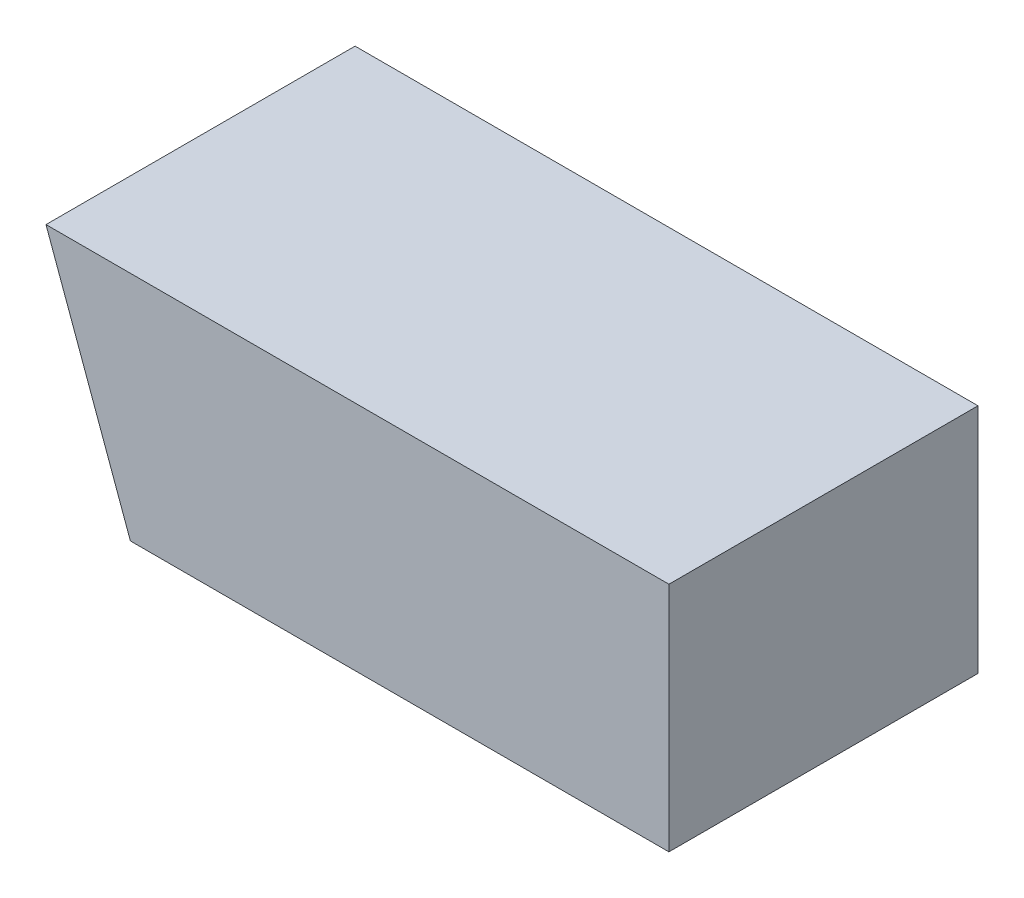
ISO-10303-21;
HEADER;
FILE_DESCRIPTION(('STEP AP214'),'2;1');
FILE_NAME('part.step','',(''),(''),'','','');
FILE_SCHEMA(('AUTOMOTIVE_DESIGN { 1 0 10303 214 1 1 1 1 }'));
ENDSEC;
DATA;
#1=APPLICATION_CONTEXT('core data for automotive mechanical design processes');
#2=APPLICATION_PROTOCOL_DEFINITION('international standard','automotive_design',2000,#1);
#3=PRODUCT_CONTEXT('',#1,'mechanical');
#4=PRODUCT('Part','Part','',(#3));
#5=PRODUCT_RELATED_PRODUCT_CATEGORY('part','',(#4));
#6=PRODUCT_DEFINITION_FORMATION('','',#4);
#7=PRODUCT_DEFINITION_CONTEXT('part definition',#1,'design');
#8=PRODUCT_DEFINITION('design','',#6,#7);
#9=PRODUCT_DEFINITION_SHAPE('','',#8);
#10=(LENGTH_UNIT() NAMED_UNIT(*) SI_UNIT(.MILLI.,.METRE.));
#11=(NAMED_UNIT(*) PLANE_ANGLE_UNIT() SI_UNIT($,.RADIAN.));
#12=(NAMED_UNIT(*) SI_UNIT($,.STERADIAN.) SOLID_ANGLE_UNIT());
#13=UNCERTAINTY_MEASURE_WITH_UNIT(LENGTH_MEASURE(1.E-05),#10,'distance_accuracy_value','');
#14=(GEOMETRIC_REPRESENTATION_CONTEXT(3) GLOBAL_UNCERTAINTY_ASSIGNED_CONTEXT((#13)) GLOBAL_UNIT_ASSIGNED_CONTEXT((#10,
#11,#12)) REPRESENTATION_CONTEXT('',''));
#15=CARTESIAN_POINT('',(0.,0.,0.));
#16=DIRECTION('',(0.,0.,1.));
#17=DIRECTION('',(1.,0.,0.));
#18=AXIS2_PLACEMENT_3D('',#15,#16,#17);
#19=CARTESIAN_POINT('',(2836.90296555019,3515.,150.000000000003));
#20=DIRECTION('',(0.93969262078591,0.342020143325663,0.));
#21=DIRECTION('',(-0.342020143325663,0.939692620785911,0.));
#22=AXIS2_PLACEMENT_3D('',#19,#20,#21);
#23=PLANE('',#22);
#24=DIRECTION('',(-0.342020143325663,0.939692620785911,0.));
#25=VECTOR('',#24,1.);
#26=CARTESIAN_POINT('',(3378.59507927869,2026.71314923427,-49.999999999997));
#27=LINE('',#26,#25);
#28=CARTESIAN_POINT('',(2891.49850069012,3365.,-49.9999999999969));
#29=VERTEX_POINT('',#28);
#30=CARTESIAN_POINT('',(2836.90296555019,3515.,-49.999999999997));
#31=VERTEX_POINT('',#30);
#32=EDGE_CURVE('E38',#29,#31,#27,.T.);
#33=ORIENTED_EDGE('',*,*,#32,.F.);
#34=DIRECTION('',(0.,0.,-1.));
#35=VECTOR('',#34,1.);
#36=CARTESIAN_POINT('',(2891.49850069012,3365.,150.000000000003));
#37=LINE('',#36,#35);
#38=CARTESIAN_POINT('',(2891.49850069012,3365.,150.000000000003));
#39=VERTEX_POINT('',#38);
#40=EDGE_CURVE('E92',#39,#29,#37,.T.);
#41=ORIENTED_EDGE('',*,*,#40,.F.);
#42=DIRECTION('',(0.342020143325663,-0.939692620785911,0.));
#43=VECTOR('',#42,1.);
#44=CARTESIAN_POINT('',(2898.99207069383,3344.41158562369,150.));
#45=LINE('',#44,#43);
#46=CARTESIAN_POINT('',(2836.90296555019,3515.,150.000000000003));
#47=VERTEX_POINT('',#46);
#48=EDGE_CURVE('E84',#47,#39,#45,.T.);
#49=ORIENTED_EDGE('',*,*,#48,.F.);
#50=DIRECTION('',(0.,0.,1.));
#51=VECTOR('',#50,1.);
#52=CARTESIAN_POINT('',(2836.90296555019,3515.,150.000000000003));
#53=LINE('',#52,#51);
#54=EDGE_CURVE('E43',#31,#47,#53,.T.);
#55=ORIENTED_EDGE('',*,*,#54,.F.);
#56=EDGE_LOOP('',(#33,#41,#49,#55));
#57=FACE_BOUND('',#56,.T.);
#58=ADVANCED_FACE('F34',(#57),#23,.F.);
#59=CARTESIAN_POINT('',(3240.,2107.5,-60.));
#60=DIRECTION('',(-1.,0.,0.));
#61=DIRECTION('',(0.,0.,1.));
#62=AXIS2_PLACEMENT_3D('',#59,#60,#61);
#63=PLANE('',#62);
#64=DIRECTION('',(0.,0.,1.));
#65=VECTOR('',#64,1.);
#66=CARTESIAN_POINT('',(3240.,3365.,150.000000000003));
#67=LINE('',#66,#65);
#68=CARTESIAN_POINT('',(3240.,3365.,-49.9999999999969));
#69=VERTEX_POINT('',#68);
#70=CARTESIAN_POINT('',(3240.,3365.,150.));
#71=VERTEX_POINT('',#70);
#72=EDGE_CURVE('E87',#69,#71,#67,.T.);
#73=ORIENTED_EDGE('',*,*,#72,.F.);
#74=DIRECTION('',(0.,-1.,0.));
#75=VECTOR('',#74,1.);
#76=CARTESIAN_POINT('',(3240.,3515.,-49.999999999997));
#77=LINE('',#76,#75);
#78=CARTESIAN_POINT('',(3240.,3515.,-49.999999999997));
#79=VERTEX_POINT('',#78);
#80=EDGE_CURVE('E83',#79,#69,#77,.T.);
#81=ORIENTED_EDGE('',*,*,#80,.F.);
#82=DIRECTION('',(0.,0.,-1.));
#83=VECTOR('',#82,1.);
#84=CARTESIAN_POINT('',(3240.,3515.,150.000000000003));
#85=LINE('',#84,#83);
#86=CARTESIAN_POINT('',(3240.,3515.,150.000000000003));
#87=VERTEX_POINT('',#86);
#88=EDGE_CURVE('E76',#87,#79,#85,.T.);
#89=ORIENTED_EDGE('',*,*,#88,.F.);
#90=DIRECTION('',(0.,1.,0.));
#91=VECTOR('',#90,1.);
#92=CARTESIAN_POINT('',(3240.,2347.5,150.));
#93=LINE('',#92,#91);
#94=EDGE_CURVE('E11',#71,#87,#93,.T.);
#95=ORIENTED_EDGE('',*,*,#94,.F.);
#96=EDGE_LOOP('',(#73,#81,#89,#95));
#97=FACE_BOUND('',#96,.T.);
#98=ADVANCED_FACE('F86',(#97),#63,.F.);
#99=CARTESIAN_POINT('',(2606.17851156066,3365.,150.000000000003));
#100=DIRECTION('',(0.,1.,0.));
#101=DIRECTION('',(0.,0.,1.));
#102=AXIS2_PLACEMENT_3D('',#99,#100,#101);
#103=PLANE('',#102);
#104=DIRECTION('',(1.,0.,0.));
#105=VECTOR('',#104,1.);
#106=CARTESIAN_POINT('',(2606.17851156066,3365.,150.000000000003));
#107=LINE('',#106,#105);
#108=EDGE_CURVE('E96',#39,#71,#107,.T.);
#109=ORIENTED_EDGE('',*,*,#108,.F.);
#110=ORIENTED_EDGE('',*,*,#40,.T.);
#111=DIRECTION('',(1.,0.,0.));
#112=VECTOR('',#111,1.);
#113=CARTESIAN_POINT('',(2606.17851156066,3365.,-49.9999999999969));
#114=LINE('',#113,#112);
#115=EDGE_CURVE('E93',#29,#69,#114,.T.);
#116=ORIENTED_EDGE('',*,*,#115,.T.);
#117=ORIENTED_EDGE('',*,*,#72,.T.);
#118=EDGE_LOOP('',(#109,#110,#116,#117));
#119=FACE_BOUND('',#118,.T.);
#120=ADVANCED_FACE('F106',(#119),#103,.F.);
#121=CARTESIAN_POINT('',(2606.17851156066,3515.,150.000000000003));
#122=DIRECTION('',(0.,-1.,0.));
#123=DIRECTION('',(0.,0.,-1.));
#124=AXIS2_PLACEMENT_3D('',#121,#122,#123);
#125=PLANE('',#124);
#126=DIRECTION('',(1.,0.,0.));
#127=VECTOR('',#126,1.);
#128=CARTESIAN_POINT('',(2606.17851156066,3515.,-49.999999999997));
#129=LINE('',#128,#127);
#130=EDGE_CURVE('E80',#31,#79,#129,.T.);
#131=ORIENTED_EDGE('',*,*,#130,.F.);
#132=ORIENTED_EDGE('',*,*,#54,.T.);
#133=DIRECTION('',(1.,0.,0.));
#134=VECTOR('',#133,1.);
#135=CARTESIAN_POINT('',(2606.17851156066,3515.,150.000000000003));
#136=LINE('',#135,#134);
#137=EDGE_CURVE('E82',#47,#87,#136,.T.);
#138=ORIENTED_EDGE('',*,*,#137,.T.);
#139=ORIENTED_EDGE('',*,*,#88,.T.);
#140=EDGE_LOOP('',(#131,#132,#138,#139));
#141=FACE_BOUND('',#140,.T.);
#142=ADVANCED_FACE('F78',(#141),#125,.F.);
#143=CARTESIAN_POINT('',(160.,2347.5,150.));
#144=DIRECTION('',(0.,0.,-1.));
#145=DIRECTION('',(-1.,0.,0.));
#146=AXIS2_PLACEMENT_3D('',#143,#144,#145);
#147=PLANE('',#146);
#148=ORIENTED_EDGE('',*,*,#137,.F.);
#149=ORIENTED_EDGE('',*,*,#48,.T.);
#150=ORIENTED_EDGE('',*,*,#108,.T.);
#151=ORIENTED_EDGE('',*,*,#94,.T.);
#152=EDGE_LOOP('',(#148,#149,#150,#151));
#153=FACE_BOUND('',#152,.T.);
#154=ADVANCED_FACE('F103',(#153),#147,.F.);
#155=CARTESIAN_POINT('',(3600.5551275464,2107.5,-49.999999999997));
#156=DIRECTION('',(0.,0.,1.));
#157=DIRECTION('',(0.,-1.,0.));
#158=AXIS2_PLACEMENT_3D('',#155,#156,#157);
#159=PLANE('',#158);
#160=ORIENTED_EDGE('',*,*,#115,.F.);
#161=ORIENTED_EDGE('',*,*,#32,.T.);
#162=ORIENTED_EDGE('',*,*,#130,.T.);
#163=ORIENTED_EDGE('',*,*,#80,.T.);
#164=EDGE_LOOP('',(#160,#161,#162,#163));
#165=FACE_BOUND('',#164,.T.);
#166=ADVANCED_FACE('F36',(#165),#159,.F.);
#167=CLOSED_SHELL('',(#58,#98,#120,#142,#154,#166));
#168=MANIFOLD_SOLID_BREP('B2',#167);
#169=ADVANCED_BREP_SHAPE_REPRESENTATION('',(#18,#168),#14);
#170=SHAPE_DEFINITION_REPRESENTATION(#9,#169);
ENDSEC;
END-ISO-10303-21;
